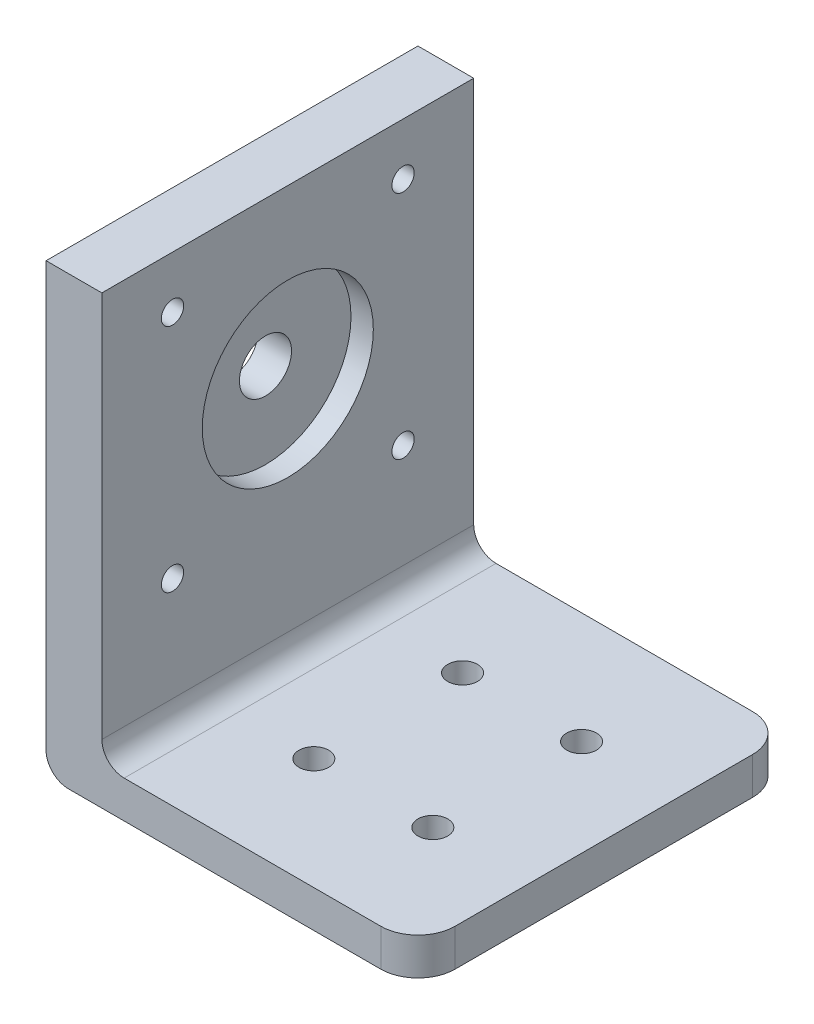
ISO-10303-21;
HEADER;
FILE_DESCRIPTION(('STEP AP214'),'2;1');
FILE_NAME('part.step','',(''),(''),'','','');
FILE_SCHEMA(('AUTOMOTIVE_DESIGN { 1 0 10303 214 1 1 1 1 }'));
ENDSEC;
DATA;
#1=APPLICATION_CONTEXT('core data for automotive mechanical design processes');
#2=APPLICATION_PROTOCOL_DEFINITION('international standard','automotive_design',2000,#1);
#3=PRODUCT_CONTEXT('',#1,'mechanical');
#4=PRODUCT('Part','Part','',(#3));
#5=PRODUCT_RELATED_PRODUCT_CATEGORY('part','',(#4));
#6=PRODUCT_DEFINITION_FORMATION('','',#4);
#7=PRODUCT_DEFINITION_CONTEXT('part definition',#1,'design');
#8=PRODUCT_DEFINITION('design','',#6,#7);
#9=PRODUCT_DEFINITION_SHAPE('','',#8);
#10=(LENGTH_UNIT() NAMED_UNIT(*) SI_UNIT(.MILLI.,.METRE.));
#11=(NAMED_UNIT(*) PLANE_ANGLE_UNIT() SI_UNIT($,.RADIAN.));
#12=(NAMED_UNIT(*) SI_UNIT($,.STERADIAN.) SOLID_ANGLE_UNIT());
#13=UNCERTAINTY_MEASURE_WITH_UNIT(LENGTH_MEASURE(1.E-05),#10,'distance_accuracy_value','');
#14=(GEOMETRIC_REPRESENTATION_CONTEXT(3) GLOBAL_UNCERTAINTY_ASSIGNED_CONTEXT((#13)) GLOBAL_UNIT_ASSIGNED_CONTEXT((#10,
#11,#12)) REPRESENTATION_CONTEXT('',''));
#15=CARTESIAN_POINT('',(0.,0.,0.));
#16=DIRECTION('',(0.,0.,1.));
#17=DIRECTION('',(1.,0.,0.));
#18=AXIS2_PLACEMENT_3D('',#15,#16,#17);
#19=CARTESIAN_POINT('',(25.,37.5,0.));
#20=DIRECTION('',(-1.,0.,0.));
#21=DIRECTION('',(0.,0.,1.));
#22=AXIS2_PLACEMENT_3D('',#19,#20,#21);
#23=CYLINDRICAL_SURFACE('',#22,3.5);
#24=CARTESIAN_POINT('',(-25.,37.5,0.));
#25=DIRECTION('',(-1.,0.,0.));
#26=DIRECTION('',(0.,0.,1.));
#27=AXIS2_PLACEMENT_3D('',#24,#25,#26);
#28=CIRCLE('',#27,3.5);
#29=CARTESIAN_POINT('',(-25.,37.5,3.5));
#30=VERTEX_POINT('',#29);
#31=EDGE_CURVE('E237',#30,#30,#28,.T.);
#32=ORIENTED_EDGE('',*,*,#31,.T.);
#33=EDGE_LOOP('',(#32));
#34=FACE_BOUND('',#33,.T.);
#35=CARTESIAN_POINT('',(-20.5,37.5,0.));
#36=DIRECTION('',(1.,0.,0.));
#37=DIRECTION('',(0.,0.,-1.));
#38=AXIS2_PLACEMENT_3D('',#35,#36,#37);
#39=CIRCLE('',#38,3.5);
#40=CARTESIAN_POINT('',(-20.5,37.5,-3.5));
#41=VERTEX_POINT('',#40);
#42=EDGE_CURVE('E46',#41,#41,#39,.F.);
#43=ORIENTED_EDGE('',*,*,#42,.F.);
#44=EDGE_LOOP('',(#43));
#45=FACE_BOUND('',#44,.T.);
#46=ADVANCED_FACE('F42',(#34,#45),#23,.F.);
#47=CARTESIAN_POINT('',(20.,5.,20.));
#48=DIRECTION('',(0.,1.,0.));
#49=DIRECTION('',(0.,0.,1.));
#50=AXIS2_PLACEMENT_3D('',#47,#48,#49);
#51=PLANE('',#50);
#52=CARTESIAN_POINT('',(-4.,5.,10.));
#53=DIRECTION('',(0.,1.,0.));
#54=DIRECTION('',(0.,0.,1.));
#55=AXIS2_PLACEMENT_3D('',#52,#53,#54);
#56=CIRCLE('',#55,2.);
#57=CARTESIAN_POINT('',(-4.,5.,12.));
#58=VERTEX_POINT('',#57);
#59=EDGE_CURVE('E258',#58,#58,#56,.T.);
#60=ORIENTED_EDGE('',*,*,#59,.F.);
#61=EDGE_LOOP('',(#60));
#62=FACE_BOUND('',#61,.T.);
#63=CARTESIAN_POINT('',(12.,5.,-10.));
#64=DIRECTION('',(0.,1.,0.));
#65=DIRECTION('',(0.,0.,-1.));
#66=AXIS2_PLACEMENT_3D('',#63,#64,#65);
#67=CIRCLE('',#66,2.);
#68=CARTESIAN_POINT('',(12.,5.,-12.));
#69=VERTEX_POINT('',#68);
#70=EDGE_CURVE('E264',#69,#69,#67,.T.);
#71=ORIENTED_EDGE('',*,*,#70,.F.);
#72=EDGE_LOOP('',(#71));
#73=FACE_BOUND('',#72,.T.);
#74=CARTESIAN_POINT('',(-4.,5.,-10.));
#75=DIRECTION('',(0.,1.,0.));
#76=DIRECTION('',(0.,0.,-1.));
#77=AXIS2_PLACEMENT_3D('',#74,#75,#76);
#78=CIRCLE('',#77,2.);
#79=CARTESIAN_POINT('',(-4.,5.,-12.));
#80=VERTEX_POINT('',#79);
#81=EDGE_CURVE('E265',#80,#80,#78,.T.);
#82=ORIENTED_EDGE('',*,*,#81,.F.);
#83=EDGE_LOOP('',(#82));
#84=FACE_BOUND('',#83,.T.);
#85=CARTESIAN_POINT('',(12.,5.,10.));
#86=DIRECTION('',(0.,1.,0.));
#87=DIRECTION('',(0.,0.,1.));
#88=AXIS2_PLACEMENT_3D('',#85,#86,#87);
#89=CIRCLE('',#88,2.);
#90=CARTESIAN_POINT('',(12.,5.,12.));
#91=VERTEX_POINT('',#90);
#92=EDGE_CURVE('E255',#91,#91,#89,.T.);
#93=ORIENTED_EDGE('',*,*,#92,.F.);
#94=EDGE_LOOP('',(#93));
#95=FACE_BOUND('',#94,.T.);
#96=DIRECTION('',(-1.,0.,0.));
#97=VECTOR('',#96,1.);
#98=CARTESIAN_POINT('',(-25.,5.,-25.));
#99=LINE('',#98,#97);
#100=CARTESIAN_POINT('',(20.,5.,-25.));
#101=VERTEX_POINT('',#100);
#102=CARTESIAN_POINT('',(-14.5,5.,-25.));
#103=VERTEX_POINT('',#102);
#104=EDGE_CURVE('E160',#101,#103,#99,.T.);
#105=ORIENTED_EDGE('',*,*,#104,.T.);
#106=DIRECTION('',(0.,0.,1.));
#107=VECTOR('',#106,1.);
#108=CARTESIAN_POINT('',(-14.5,5.,25.));
#109=LINE('',#108,#107);
#110=CARTESIAN_POINT('',(-14.5,5.,25.));
#111=VERTEX_POINT('',#110);
#112=EDGE_CURVE('E188',#103,#111,#109,.T.);
#113=ORIENTED_EDGE('',*,*,#112,.T.);
#114=DIRECTION('',(1.,0.,0.));
#115=VECTOR('',#114,1.);
#116=CARTESIAN_POINT('',(-25.,5.,25.));
#117=LINE('',#116,#115);
#118=CARTESIAN_POINT('',(20.,5.,25.));
#119=VERTEX_POINT('',#118);
#120=EDGE_CURVE('E151',#111,#119,#117,.T.);
#121=ORIENTED_EDGE('',*,*,#120,.T.);
#122=CARTESIAN_POINT('',(20.,5.,20.));
#123=DIRECTION('',(0.,1.,0.));
#124=DIRECTION('',(0.,0.,1.));
#125=AXIS2_PLACEMENT_3D('',#122,#123,#124);
#126=CIRCLE('',#125,5.);
#127=CARTESIAN_POINT('',(25.,5.,20.));
#128=VERTEX_POINT('',#127);
#129=EDGE_CURVE('E153',#119,#128,#126,.T.);
#130=ORIENTED_EDGE('',*,*,#129,.T.);
#131=DIRECTION('',(0.,0.,-1.));
#132=VECTOR('',#131,1.);
#133=CARTESIAN_POINT('',(25.,5.,-20.));
#134=LINE('',#133,#132);
#135=CARTESIAN_POINT('',(25.,5.,-20.));
#136=VERTEX_POINT('',#135);
#137=EDGE_CURVE('E156',#128,#136,#134,.T.);
#138=ORIENTED_EDGE('',*,*,#137,.T.);
#139=CARTESIAN_POINT('',(20.,5.,-20.));
#140=DIRECTION('',(0.,1.,0.));
#141=DIRECTION('',(0.,0.,-1.));
#142=AXIS2_PLACEMENT_3D('',#139,#140,#141);
#143=CIRCLE('',#142,5.);
#144=EDGE_CURVE('E158',#136,#101,#143,.T.);
#145=ORIENTED_EDGE('',*,*,#144,.T.);
#146=EDGE_LOOP('',(#105,#113,#121,#130,#138,#145));
#147=FACE_BOUND('',#146,.T.);
#148=ADVANCED_FACE('F281',(#62,#73,#84,#95,#147),#51,.T.);
#149=CARTESIAN_POINT('',(-25.,5.,-25.));
#150=DIRECTION('',(1.,0.,0.));
#151=DIRECTION('',(0.,0.,-1.));
#152=AXIS2_PLACEMENT_3D('',#149,#150,#151);
#153=PLANE('',#152);
#154=CARTESIAN_POINT('',(-25.,22.,-15.5));
#155=DIRECTION('',(-1.,0.,0.));
#156=DIRECTION('',(0.,0.,1.));
#157=AXIS2_PLACEMENT_3D('',#154,#155,#156);
#158=CIRCLE('',#157,1.5);
#159=CARTESIAN_POINT('',(-25.,22.,-14.));
#160=VERTEX_POINT('',#159);
#161=EDGE_CURVE('E240',#160,#160,#158,.T.);
#162=ORIENTED_EDGE('',*,*,#161,.F.);
#163=EDGE_LOOP('',(#162));
#164=FACE_BOUND('',#163,.T.);
#165=CARTESIAN_POINT('',(-25.,22.,15.5));
#166=DIRECTION('',(-1.,0.,0.));
#167=DIRECTION('',(0.,0.,-1.));
#168=AXIS2_PLACEMENT_3D('',#165,#166,#167);
#169=CIRCLE('',#168,1.5);
#170=CARTESIAN_POINT('',(-25.,22.,14.));
#171=VERTEX_POINT('',#170);
#172=EDGE_CURVE('E243',#171,#171,#169,.T.);
#173=ORIENTED_EDGE('',*,*,#172,.F.);
#174=EDGE_LOOP('',(#173));
#175=FACE_BOUND('',#174,.T.);
#176=ORIENTED_EDGE('',*,*,#31,.F.);
#177=EDGE_LOOP('',(#176));
#178=FACE_BOUND('',#177,.T.);
#179=CARTESIAN_POINT('',(-25.,53.,-15.5));
#180=DIRECTION('',(-1.,0.,0.));
#181=DIRECTION('',(0.,0.,-1.));
#182=AXIS2_PLACEMENT_3D('',#179,#180,#181);
#183=CIRCLE('',#182,1.5);
#184=CARTESIAN_POINT('',(-25.,53.,-17.));
#185=VERTEX_POINT('',#184);
#186=EDGE_CURVE('E235',#185,#185,#183,.T.);
#187=ORIENTED_EDGE('',*,*,#186,.F.);
#188=EDGE_LOOP('',(#187));
#189=FACE_BOUND('',#188,.T.);
#190=CARTESIAN_POINT('',(-25.,53.,15.5));
#191=DIRECTION('',(-1.,0.,0.));
#192=DIRECTION('',(0.,0.,1.));
#193=AXIS2_PLACEMENT_3D('',#190,#191,#192);
#194=CIRCLE('',#193,1.5);
#195=CARTESIAN_POINT('',(-25.,53.,17.));
#196=VERTEX_POINT('',#195);
#197=EDGE_CURVE('E205',#196,#196,#194,.T.);
#198=ORIENTED_EDGE('',*,*,#197,.F.);
#199=EDGE_LOOP('',(#198));
#200=FACE_BOUND('',#199,.T.);
#201=DIRECTION('',(0.,-1.,0.));
#202=VECTOR('',#201,1.);
#203=CARTESIAN_POINT('',(-25.,5.,-25.));
#204=LINE('',#203,#202);
#205=CARTESIAN_POINT('',(-25.,60.,-25.));
#206=VERTEX_POINT('',#205);
#207=CARTESIAN_POINT('',(-25.,3.,-25.));
#208=VERTEX_POINT('',#207);
#209=EDGE_CURVE('E163',#206,#208,#204,.T.);
#210=ORIENTED_EDGE('',*,*,#209,.T.);
#211=DIRECTION('',(0.,0.,1.));
#212=VECTOR('',#211,1.);
#213=CARTESIAN_POINT('',(-25.,3.,-25.));
#214=LINE('',#213,#212);
#215=CARTESIAN_POINT('',(-25.,3.,25.));
#216=VERTEX_POINT('',#215);
#217=EDGE_CURVE('E196',#208,#216,#214,.T.);
#218=ORIENTED_EDGE('',*,*,#217,.T.);
#219=DIRECTION('',(0.,-1.,0.));
#220=VECTOR('',#219,1.);
#221=CARTESIAN_POINT('',(-25.,5.,25.));
#222=LINE('',#221,#220);
#223=CARTESIAN_POINT('',(-25.,60.,25.));
#224=VERTEX_POINT('',#223);
#225=EDGE_CURVE('E186',#224,#216,#222,.T.);
#226=ORIENTED_EDGE('',*,*,#225,.F.);
#227=DIRECTION('',(0.,0.,1.));
#228=VECTOR('',#227,1.);
#229=CARTESIAN_POINT('',(-25.,60.,-25.));
#230=LINE('',#229,#228);
#231=EDGE_CURVE('E129',#206,#224,#230,.T.);
#232=ORIENTED_EDGE('',*,*,#231,.F.);
#233=EDGE_LOOP('',(#210,#218,#226,#232));
#234=FACE_BOUND('',#233,.T.);
#235=ADVANCED_FACE('F284',(#164,#175,#178,#189,#200,#234),#153,.F.);
#236=CARTESIAN_POINT('',(-25.,5.,25.));
#237=DIRECTION('',(0.,0.,-1.));
#238=DIRECTION('',(-1.,0.,0.));
#239=AXIS2_PLACEMENT_3D('',#236,#237,#238);
#240=PLANE('',#239);
#241=ORIENTED_EDGE('',*,*,#225,.T.);
#242=CARTESIAN_POINT('',(-22.,3.,25.));
#243=DIRECTION('',(0.,0.,-1.));
#244=DIRECTION('',(-1.,0.,0.));
#245=AXIS2_PLACEMENT_3D('',#242,#243,#244);
#246=CIRCLE('',#245,3.);
#247=CARTESIAN_POINT('',(-22.,0.,25.));
#248=VERTEX_POINT('',#247);
#249=EDGE_CURVE('E66',#216,#248,#246,.F.);
#250=ORIENTED_EDGE('',*,*,#249,.T.);
#251=DIRECTION('',(1.,0.,0.));
#252=VECTOR('',#251,1.);
#253=CARTESIAN_POINT('',(-25.,0.,25.));
#254=LINE('',#253,#252);
#255=CARTESIAN_POINT('',(20.,0.,25.));
#256=VERTEX_POINT('',#255);
#257=EDGE_CURVE('E139',#248,#256,#254,.T.);
#258=ORIENTED_EDGE('',*,*,#257,.T.);
#259=DIRECTION('',(0.,-1.,0.));
#260=VECTOR('',#259,1.);
#261=CARTESIAN_POINT('',(20.,5.,25.));
#262=LINE('',#261,#260);
#263=EDGE_CURVE('E183',#119,#256,#262,.T.);
#264=ORIENTED_EDGE('',*,*,#263,.F.);
#265=ORIENTED_EDGE('',*,*,#120,.F.);
#266=CARTESIAN_POINT('',(-14.5,8.,25.));
#267=DIRECTION('',(0.,0.,-1.));
#268=DIRECTION('',(-1.,0.,0.));
#269=AXIS2_PLACEMENT_3D('',#266,#267,#268);
#270=CIRCLE('',#269,3.);
#271=CARTESIAN_POINT('',(-17.5,8.,25.));
#272=VERTEX_POINT('',#271);
#273=EDGE_CURVE('E136',#111,#272,#270,.T.);
#274=ORIENTED_EDGE('',*,*,#273,.T.);
#275=DIRECTION('',(0.,-1.,0.));
#276=VECTOR('',#275,1.);
#277=CARTESIAN_POINT('',(-17.5,60.,25.));
#278=LINE('',#277,#276);
#279=CARTESIAN_POINT('',(-17.5,60.,25.));
#280=VERTEX_POINT('',#279);
#281=EDGE_CURVE('E133',#280,#272,#278,.T.);
#282=ORIENTED_EDGE('',*,*,#281,.F.);
#283=DIRECTION('',(1.,0.,0.));
#284=VECTOR('',#283,1.);
#285=CARTESIAN_POINT('',(-25.,60.,25.));
#286=LINE('',#285,#284);
#287=EDGE_CURVE('E121',#224,#280,#286,.T.);
#288=ORIENTED_EDGE('',*,*,#287,.F.);
#289=EDGE_LOOP('',(#241,#250,#258,#264,#265,#274,#282,#288));
#290=FACE_BOUND('',#289,.T.);
#291=ADVANCED_FACE('F134',(#290),#240,.F.);
#292=CARTESIAN_POINT('',(20.,5.,20.));
#293=DIRECTION('',(0.,-1.,0.));
#294=DIRECTION('',(0.,0.,-1.));
#295=AXIS2_PLACEMENT_3D('',#292,#293,#294);
#296=CYLINDRICAL_SURFACE('',#295,5.);
#297=CARTESIAN_POINT('',(20.,0.,20.));
#298=DIRECTION('',(0.,1.,0.));
#299=DIRECTION('',(0.,0.,1.));
#300=AXIS2_PLACEMENT_3D('',#297,#298,#299);
#301=CIRCLE('',#300,5.);
#302=CARTESIAN_POINT('',(25.,0.,20.));
#303=VERTEX_POINT('',#302);
#304=EDGE_CURVE('E165',#256,#303,#301,.T.);
#305=ORIENTED_EDGE('',*,*,#304,.T.);
#306=DIRECTION('',(0.,-1.,0.));
#307=VECTOR('',#306,1.);
#308=CARTESIAN_POINT('',(25.,5.,20.));
#309=LINE('',#308,#307);
#310=EDGE_CURVE('E180',#128,#303,#309,.T.);
#311=ORIENTED_EDGE('',*,*,#310,.F.);
#312=ORIENTED_EDGE('',*,*,#129,.F.);
#313=ORIENTED_EDGE('',*,*,#263,.T.);
#314=EDGE_LOOP('',(#305,#311,#312,#313));
#315=FACE_BOUND('',#314,.T.);
#316=ADVANCED_FACE('F336',(#315),#296,.T.);
#317=CARTESIAN_POINT('',(25.,5.,-20.));
#318=DIRECTION('',(-1.,0.,0.));
#319=DIRECTION('',(0.,0.,1.));
#320=AXIS2_PLACEMENT_3D('',#317,#318,#319);
#321=PLANE('',#320);
#322=DIRECTION('',(0.,0.,-1.));
#323=VECTOR('',#322,1.);
#324=CARTESIAN_POINT('',(25.,0.,-20.));
#325=LINE('',#324,#323);
#326=CARTESIAN_POINT('',(25.,0.,-20.));
#327=VERTEX_POINT('',#326);
#328=EDGE_CURVE('E167',#303,#327,#325,.T.);
#329=ORIENTED_EDGE('',*,*,#328,.T.);
#330=DIRECTION('',(0.,-1.,0.));
#331=VECTOR('',#330,1.);
#332=CARTESIAN_POINT('',(25.,5.,-20.));
#333=LINE('',#332,#331);
#334=EDGE_CURVE('E177',#136,#327,#333,.T.);
#335=ORIENTED_EDGE('',*,*,#334,.F.);
#336=ORIENTED_EDGE('',*,*,#137,.F.);
#337=ORIENTED_EDGE('',*,*,#310,.T.);
#338=EDGE_LOOP('',(#329,#335,#336,#337));
#339=FACE_BOUND('',#338,.T.);
#340=ADVANCED_FACE('F332',(#339),#321,.F.);
#341=CARTESIAN_POINT('',(20.,5.,-20.));
#342=DIRECTION('',(0.,-1.,0.));
#343=DIRECTION('',(0.,0.,-1.));
#344=AXIS2_PLACEMENT_3D('',#341,#342,#343);
#345=CYLINDRICAL_SURFACE('',#344,5.);
#346=CARTESIAN_POINT('',(20.,0.,-20.));
#347=DIRECTION('',(0.,1.,0.));
#348=DIRECTION('',(0.,0.,-1.));
#349=AXIS2_PLACEMENT_3D('',#346,#347,#348);
#350=CIRCLE('',#349,5.);
#351=CARTESIAN_POINT('',(20.,0.,-25.));
#352=VERTEX_POINT('',#351);
#353=EDGE_CURVE('E169',#327,#352,#350,.T.);
#354=ORIENTED_EDGE('',*,*,#353,.T.);
#355=DIRECTION('',(0.,-1.,0.));
#356=VECTOR('',#355,1.);
#357=CARTESIAN_POINT('',(20.,5.,-25.));
#358=LINE('',#357,#356);
#359=EDGE_CURVE('E174',#101,#352,#358,.T.);
#360=ORIENTED_EDGE('',*,*,#359,.F.);
#361=ORIENTED_EDGE('',*,*,#144,.F.);
#362=ORIENTED_EDGE('',*,*,#334,.T.);
#363=EDGE_LOOP('',(#354,#360,#361,#362));
#364=FACE_BOUND('',#363,.T.);
#365=ADVANCED_FACE('F329',(#364),#345,.T.);
#366=CARTESIAN_POINT('',(-25.,5.,-25.));
#367=DIRECTION('',(0.,0.,1.));
#368=DIRECTION('',(1.,0.,0.));
#369=AXIS2_PLACEMENT_3D('',#366,#367,#368);
#370=PLANE('',#369);
#371=DIRECTION('',(-1.,0.,0.));
#372=VECTOR('',#371,1.);
#373=CARTESIAN_POINT('',(-25.,0.,-25.));
#374=LINE('',#373,#372);
#375=CARTESIAN_POINT('',(-22.,0.,-25.));
#376=VERTEX_POINT('',#375);
#377=EDGE_CURVE('E154',#352,#376,#374,.T.);
#378=ORIENTED_EDGE('',*,*,#377,.T.);
#379=CARTESIAN_POINT('',(-22.,3.,-25.));
#380=DIRECTION('',(0.,0.,1.));
#381=DIRECTION('',(1.,0.,0.));
#382=AXIS2_PLACEMENT_3D('',#379,#380,#381);
#383=CIRCLE('',#382,3.);
#384=EDGE_CURVE('E11',#376,#208,#383,.F.);
#385=ORIENTED_EDGE('',*,*,#384,.T.);
#386=ORIENTED_EDGE('',*,*,#209,.F.);
#387=DIRECTION('',(1.,0.,0.));
#388=VECTOR('',#387,1.);
#389=CARTESIAN_POINT('',(-25.,60.,-25.));
#390=LINE('',#389,#388);
#391=CARTESIAN_POINT('',(-17.5,60.,-25.));
#392=VERTEX_POINT('',#391);
#393=EDGE_CURVE('E144',#206,#392,#390,.T.);
#394=ORIENTED_EDGE('',*,*,#393,.T.);
#395=DIRECTION('',(0.,-1.,0.));
#396=VECTOR('',#395,1.);
#397=CARTESIAN_POINT('',(-17.5,60.,-25.));
#398=LINE('',#397,#396);
#399=CARTESIAN_POINT('',(-17.5,8.,-25.));
#400=VERTEX_POINT('',#399);
#401=EDGE_CURVE('E140',#392,#400,#398,.T.);
#402=ORIENTED_EDGE('',*,*,#401,.T.);
#403=CARTESIAN_POINT('',(-14.5,8.,-25.));
#404=DIRECTION('',(0.,0.,1.));
#405=DIRECTION('',(1.,0.,0.));
#406=AXIS2_PLACEMENT_3D('',#403,#404,#405);
#407=CIRCLE('',#406,3.);
#408=EDGE_CURVE('E194',#400,#103,#407,.T.);
#409=ORIENTED_EDGE('',*,*,#408,.T.);
#410=ORIENTED_EDGE('',*,*,#104,.F.);
#411=ORIENTED_EDGE('',*,*,#359,.T.);
#412=EDGE_LOOP('',(#378,#385,#386,#394,#402,#409,#410,#411));
#413=FACE_BOUND('',#412,.T.);
#414=ADVANCED_FACE('F297',(#413),#370,.F.);
#415=CARTESIAN_POINT('',(20.,0.,20.));
#416=DIRECTION('',(0.,1.,0.));
#417=DIRECTION('',(0.,0.,1.));
#418=AXIS2_PLACEMENT_3D('',#415,#416,#417);
#419=PLANE('',#418);
#420=CARTESIAN_POINT('',(-4.,0.,10.));
#421=DIRECTION('',(0.,1.,0.));
#422=DIRECTION('',(0.,0.,1.));
#423=AXIS2_PLACEMENT_3D('',#420,#421,#422);
#424=CIRCLE('',#423,2.);
#425=CARTESIAN_POINT('',(-4.,0.,12.));
#426=VERTEX_POINT('',#425);
#427=EDGE_CURVE('E268',#426,#426,#424,.T.);
#428=ORIENTED_EDGE('',*,*,#427,.T.);
#429=EDGE_LOOP('',(#428));
#430=FACE_BOUND('',#429,.T.);
#431=CARTESIAN_POINT('',(12.,0.,-10.));
#432=DIRECTION('',(0.,1.,0.));
#433=DIRECTION('',(0.,0.,-1.));
#434=AXIS2_PLACEMENT_3D('',#431,#432,#433);
#435=CIRCLE('',#434,2.);
#436=CARTESIAN_POINT('',(12.,0.,-12.));
#437=VERTEX_POINT('',#436);
#438=EDGE_CURVE('E261',#437,#437,#435,.T.);
#439=ORIENTED_EDGE('',*,*,#438,.T.);
#440=EDGE_LOOP('',(#439));
#441=FACE_BOUND('',#440,.T.);
#442=CARTESIAN_POINT('',(-4.,0.,-10.));
#443=DIRECTION('',(0.,1.,0.));
#444=DIRECTION('',(0.,0.,-1.));
#445=AXIS2_PLACEMENT_3D('',#442,#443,#444);
#446=CIRCLE('',#445,2.);
#447=CARTESIAN_POINT('',(-4.,0.,-12.));
#448=VERTEX_POINT('',#447);
#449=EDGE_CURVE('E273',#448,#448,#446,.T.);
#450=ORIENTED_EDGE('',*,*,#449,.T.);
#451=EDGE_LOOP('',(#450));
#452=FACE_BOUND('',#451,.T.);
#453=CARTESIAN_POINT('',(12.,0.,10.));
#454=DIRECTION('',(0.,1.,0.));
#455=DIRECTION('',(0.,0.,1.));
#456=AXIS2_PLACEMENT_3D('',#453,#454,#455);
#457=CIRCLE('',#456,2.);
#458=CARTESIAN_POINT('',(12.,0.,12.));
#459=VERTEX_POINT('',#458);
#460=EDGE_CURVE('E252',#459,#459,#457,.T.);
#461=ORIENTED_EDGE('',*,*,#460,.T.);
#462=EDGE_LOOP('',(#461));
#463=FACE_BOUND('',#462,.T.);
#464=ORIENTED_EDGE('',*,*,#257,.F.);
#465=DIRECTION('',(0.,0.,1.));
#466=VECTOR('',#465,1.);
#467=CARTESIAN_POINT('',(-22.,0.,20.));
#468=LINE('',#467,#466);
#469=EDGE_CURVE('E51',#248,#376,#468,.F.);
#470=ORIENTED_EDGE('',*,*,#469,.T.);
#471=ORIENTED_EDGE('',*,*,#377,.F.);
#472=ORIENTED_EDGE('',*,*,#353,.F.);
#473=ORIENTED_EDGE('',*,*,#328,.F.);
#474=ORIENTED_EDGE('',*,*,#304,.F.);
#475=EDGE_LOOP('',(#464,#470,#471,#472,#473,#474));
#476=FACE_BOUND('',#475,.T.);
#477=ADVANCED_FACE('F218',(#430,#441,#452,#463,#476),#419,.F.);
#478=CARTESIAN_POINT('',(-17.5,60.,-25.));
#479=DIRECTION('',(1.,0.,0.));
#480=DIRECTION('',(0.,0.,-1.));
#481=AXIS2_PLACEMENT_3D('',#478,#479,#480);
#482=PLANE('',#481);
#483=CARTESIAN_POINT('',(-17.5,37.5,0.));
#484=DIRECTION('',(1.,0.,0.));
#485=DIRECTION('',(0.,0.,-1.));
#486=AXIS2_PLACEMENT_3D('',#483,#484,#485);
#487=CIRCLE('',#486,11.5);
#488=CARTESIAN_POINT('',(-17.5,37.5,-11.5));
#489=VERTEX_POINT('',#488);
#490=EDGE_CURVE('E248',#489,#489,#487,.T.);
#491=ORIENTED_EDGE('',*,*,#490,.F.);
#492=EDGE_LOOP('',(#491));
#493=FACE_BOUND('',#492,.T.);
#494=CARTESIAN_POINT('',(-17.5,22.,-15.5));
#495=DIRECTION('',(1.,0.,0.));
#496=DIRECTION('',(0.,0.,-1.));
#497=AXIS2_PLACEMENT_3D('',#494,#495,#496);
#498=CIRCLE('',#497,1.5);
#499=CARTESIAN_POINT('',(-17.5,22.,-17.));
#500=VERTEX_POINT('',#499);
#501=EDGE_CURVE('E130',#500,#500,#498,.T.);
#502=ORIENTED_EDGE('',*,*,#501,.F.);
#503=EDGE_LOOP('',(#502));
#504=FACE_BOUND('',#503,.T.);
#505=CARTESIAN_POINT('',(-17.5,22.,15.5));
#506=DIRECTION('',(1.,0.,0.));
#507=DIRECTION('',(0.,0.,-1.));
#508=AXIS2_PLACEMENT_3D('',#505,#506,#507);
#509=CIRCLE('',#508,1.5);
#510=CARTESIAN_POINT('',(-17.5,22.,14.));
#511=VERTEX_POINT('',#510);
#512=EDGE_CURVE('E208',#511,#511,#509,.T.);
#513=ORIENTED_EDGE('',*,*,#512,.F.);
#514=EDGE_LOOP('',(#513));
#515=FACE_BOUND('',#514,.T.);
#516=CARTESIAN_POINT('',(-17.5,53.,-15.5));
#517=DIRECTION('',(1.,0.,0.));
#518=DIRECTION('',(0.,0.,-1.));
#519=AXIS2_PLACEMENT_3D('',#516,#517,#518);
#520=CIRCLE('',#519,1.5);
#521=CARTESIAN_POINT('',(-17.5,53.,-17.));
#522=VERTEX_POINT('',#521);
#523=EDGE_CURVE('E204',#522,#522,#520,.T.);
#524=ORIENTED_EDGE('',*,*,#523,.F.);
#525=EDGE_LOOP('',(#524));
#526=FACE_BOUND('',#525,.T.);
#527=CARTESIAN_POINT('',(-17.5,53.,15.5));
#528=DIRECTION('',(1.,0.,0.));
#529=DIRECTION('',(0.,0.,-1.));
#530=AXIS2_PLACEMENT_3D('',#527,#528,#529);
#531=CIRCLE('',#530,1.5);
#532=CARTESIAN_POINT('',(-17.5,53.,14.));
#533=VERTEX_POINT('',#532);
#534=EDGE_CURVE('E201',#533,#533,#531,.T.);
#535=ORIENTED_EDGE('',*,*,#534,.F.);
#536=EDGE_LOOP('',(#535));
#537=FACE_BOUND('',#536,.T.);
#538=ORIENTED_EDGE('',*,*,#281,.T.);
#539=DIRECTION('',(0.,0.,1.));
#540=VECTOR('',#539,1.);
#541=CARTESIAN_POINT('',(-17.5,8.,-25.));
#542=LINE('',#541,#540);
#543=EDGE_CURVE('E191',#272,#400,#542,.F.);
#544=ORIENTED_EDGE('',*,*,#543,.T.);
#545=ORIENTED_EDGE('',*,*,#401,.F.);
#546=DIRECTION('',(0.,0.,1.));
#547=VECTOR('',#546,1.);
#548=CARTESIAN_POINT('',(-17.5,60.,-25.));
#549=LINE('',#548,#547);
#550=EDGE_CURVE('E126',#392,#280,#549,.T.);
#551=ORIENTED_EDGE('',*,*,#550,.T.);
#552=EDGE_LOOP('',(#538,#544,#545,#551));
#553=FACE_BOUND('',#552,.T.);
#554=ADVANCED_FACE('F142',(#493,#504,#515,#526,#537,#553),#482,.T.);
#555=CARTESIAN_POINT('',(0.,60.,0.));
#556=DIRECTION('',(0.,-1.,0.));
#557=DIRECTION('',(0.,0.,-1.));
#558=AXIS2_PLACEMENT_3D('',#555,#556,#557);
#559=PLANE('',#558);
#560=ORIENTED_EDGE('',*,*,#287,.T.);
#561=ORIENTED_EDGE('',*,*,#550,.F.);
#562=ORIENTED_EDGE('',*,*,#393,.F.);
#563=ORIENTED_EDGE('',*,*,#231,.T.);
#564=EDGE_LOOP('',(#560,#561,#562,#563));
#565=FACE_BOUND('',#564,.T.);
#566=ADVANCED_FACE('F123',(#565),#559,.F.);
#567=CARTESIAN_POINT('',(-14.5,8.,20.));
#568=DIRECTION('',(0.,0.,-1.));
#569=DIRECTION('',(-1.,0.,0.));
#570=AXIS2_PLACEMENT_3D('',#567,#568,#569);
#571=CYLINDRICAL_SURFACE('',#570,3.);
#572=ORIENTED_EDGE('',*,*,#408,.F.);
#573=ORIENTED_EDGE('',*,*,#543,.F.);
#574=ORIENTED_EDGE('',*,*,#273,.F.);
#575=ORIENTED_EDGE('',*,*,#112,.F.);
#576=EDGE_LOOP('',(#572,#573,#574,#575));
#577=FACE_BOUND('',#576,.T.);
#578=ADVANCED_FACE('F296',(#577),#571,.F.);
#579=CARTESIAN_POINT('',(-22.,3.,-25.));
#580=DIRECTION('',(0.,0.,1.));
#581=DIRECTION('',(1.,0.,0.));
#582=AXIS2_PLACEMENT_3D('',#579,#580,#581);
#583=CYLINDRICAL_SURFACE('',#582,3.);
#584=ORIENTED_EDGE('',*,*,#384,.F.);
#585=ORIENTED_EDGE('',*,*,#469,.F.);
#586=ORIENTED_EDGE('',*,*,#249,.F.);
#587=ORIENTED_EDGE('',*,*,#217,.F.);
#588=EDGE_LOOP('',(#584,#585,#586,#587));
#589=FACE_BOUND('',#588,.T.);
#590=ADVANCED_FACE('F44',(#589),#583,.T.);
#591=CARTESIAN_POINT('',(25.,53.,15.5));
#592=DIRECTION('',(-1.,0.,0.));
#593=DIRECTION('',(0.,0.,1.));
#594=AXIS2_PLACEMENT_3D('',#591,#592,#593);
#595=CYLINDRICAL_SURFACE('',#594,1.5);
#596=ORIENTED_EDGE('',*,*,#534,.T.);
#597=EDGE_LOOP('',(#596));
#598=FACE_BOUND('',#597,.T.);
#599=ORIENTED_EDGE('',*,*,#197,.T.);
#600=EDGE_LOOP('',(#599));
#601=FACE_BOUND('',#600,.T.);
#602=ADVANCED_FACE('F227',(#598,#601),#595,.F.);
#603=CARTESIAN_POINT('',(25.,53.,-15.5));
#604=DIRECTION('',(-1.,0.,0.));
#605=DIRECTION('',(0.,0.,1.));
#606=AXIS2_PLACEMENT_3D('',#603,#604,#605);
#607=CYLINDRICAL_SURFACE('',#606,1.5);
#608=ORIENTED_EDGE('',*,*,#523,.T.);
#609=EDGE_LOOP('',(#608));
#610=FACE_BOUND('',#609,.T.);
#611=ORIENTED_EDGE('',*,*,#186,.T.);
#612=EDGE_LOOP('',(#611));
#613=FACE_BOUND('',#612,.T.);
#614=ADVANCED_FACE('F230',(#610,#613),#607,.F.);
#615=CARTESIAN_POINT('',(25.,22.,15.5));
#616=DIRECTION('',(-1.,0.,0.));
#617=DIRECTION('',(0.,0.,1.));
#618=AXIS2_PLACEMENT_3D('',#615,#616,#617);
#619=CYLINDRICAL_SURFACE('',#618,1.5);
#620=ORIENTED_EDGE('',*,*,#512,.T.);
#621=EDGE_LOOP('',(#620));
#622=FACE_BOUND('',#621,.T.);
#623=ORIENTED_EDGE('',*,*,#172,.T.);
#624=EDGE_LOOP('',(#623));
#625=FACE_BOUND('',#624,.T.);
#626=ADVANCED_FACE('F315',(#622,#625),#619,.F.);
#627=CARTESIAN_POINT('',(25.,22.,-15.5));
#628=DIRECTION('',(-1.,0.,0.));
#629=DIRECTION('',(0.,0.,1.));
#630=AXIS2_PLACEMENT_3D('',#627,#628,#629);
#631=CYLINDRICAL_SURFACE('',#630,1.5);
#632=ORIENTED_EDGE('',*,*,#501,.T.);
#633=EDGE_LOOP('',(#632));
#634=FACE_BOUND('',#633,.T.);
#635=ORIENTED_EDGE('',*,*,#161,.T.);
#636=EDGE_LOOP('',(#635));
#637=FACE_BOUND('',#636,.T.);
#638=ADVANCED_FACE('F213',(#634,#637),#631,.F.);
#639=CARTESIAN_POINT('',(-20.5,37.5,0.));
#640=DIRECTION('',(1.,0.,0.));
#641=DIRECTION('',(0.,0.,-1.));
#642=AXIS2_PLACEMENT_3D('',#639,#640,#641);
#643=PLANE('',#642);
#644=CARTESIAN_POINT('',(-20.5,37.5,0.));
#645=DIRECTION('',(1.,0.,0.));
#646=DIRECTION('',(0.,0.,-1.));
#647=AXIS2_PLACEMENT_3D('',#644,#645,#646);
#648=CIRCLE('',#647,11.5);
#649=CARTESIAN_POINT('',(-20.5,37.5,-11.5));
#650=VERTEX_POINT('',#649);
#651=EDGE_CURVE('E251',#650,#650,#648,.T.);
#652=ORIENTED_EDGE('',*,*,#651,.T.);
#653=EDGE_LOOP('',(#652));
#654=FACE_BOUND('',#653,.T.);
#655=ORIENTED_EDGE('',*,*,#42,.T.);
#656=EDGE_LOOP('',(#655));
#657=FACE_BOUND('',#656,.T.);
#658=ADVANCED_FACE('F320',(#654,#657),#643,.T.);
#659=CARTESIAN_POINT('',(-20.5,37.5,0.));
#660=DIRECTION('',(1.,0.,0.));
#661=DIRECTION('',(0.,0.,-1.));
#662=AXIS2_PLACEMENT_3D('',#659,#660,#661);
#663=CYLINDRICAL_SURFACE('',#662,11.5);
#664=ORIENTED_EDGE('',*,*,#651,.F.);
#665=EDGE_LOOP('',(#664));
#666=FACE_BOUND('',#665,.T.);
#667=ORIENTED_EDGE('',*,*,#490,.T.);
#668=EDGE_LOOP('',(#667));
#669=FACE_BOUND('',#668,.T.);
#670=ADVANCED_FACE('F375',(#666,#669),#663,.F.);
#671=CARTESIAN_POINT('',(12.,0.,10.));
#672=DIRECTION('',(0.,1.,0.));
#673=DIRECTION('',(0.,0.,1.));
#674=AXIS2_PLACEMENT_3D('',#671,#672,#673);
#675=CYLINDRICAL_SURFACE('',#674,2.);
#676=ORIENTED_EDGE('',*,*,#460,.F.);
#677=EDGE_LOOP('',(#676));
#678=FACE_BOUND('',#677,.T.);
#679=ORIENTED_EDGE('',*,*,#92,.T.);
#680=EDGE_LOOP('',(#679));
#681=FACE_BOUND('',#680,.T.);
#682=ADVANCED_FACE('F384',(#678,#681),#675,.F.);
#683=CARTESIAN_POINT('',(-4.,0.,-10.));
#684=DIRECTION('',(0.,1.,0.));
#685=DIRECTION('',(0.,0.,1.));
#686=AXIS2_PLACEMENT_3D('',#683,#684,#685);
#687=CYLINDRICAL_SURFACE('',#686,2.);
#688=ORIENTED_EDGE('',*,*,#449,.F.);
#689=EDGE_LOOP('',(#688));
#690=FACE_BOUND('',#689,.T.);
#691=ORIENTED_EDGE('',*,*,#81,.T.);
#692=EDGE_LOOP('',(#691));
#693=FACE_BOUND('',#692,.T.);
#694=ADVANCED_FACE('F279',(#690,#693),#687,.F.);
#695=CARTESIAN_POINT('',(12.,0.,-10.));
#696=DIRECTION('',(0.,1.,0.));
#697=DIRECTION('',(0.,0.,1.));
#698=AXIS2_PLACEMENT_3D('',#695,#696,#697);
#699=CYLINDRICAL_SURFACE('',#698,2.);
#700=ORIENTED_EDGE('',*,*,#438,.F.);
#701=EDGE_LOOP('',(#700));
#702=FACE_BOUND('',#701,.T.);
#703=ORIENTED_EDGE('',*,*,#70,.T.);
#704=EDGE_LOOP('',(#703));
#705=FACE_BOUND('',#704,.T.);
#706=ADVANCED_FACE('F400',(#702,#705),#699,.F.);
#707=CARTESIAN_POINT('',(-4.,0.,10.));
#708=DIRECTION('',(0.,1.,0.));
#709=DIRECTION('',(0.,0.,1.));
#710=AXIS2_PLACEMENT_3D('',#707,#708,#709);
#711=CYLINDRICAL_SURFACE('',#710,2.);
#712=ORIENTED_EDGE('',*,*,#427,.F.);
#713=EDGE_LOOP('',(#712));
#714=FACE_BOUND('',#713,.T.);
#715=ORIENTED_EDGE('',*,*,#59,.T.);
#716=EDGE_LOOP('',(#715));
#717=FACE_BOUND('',#716,.T.);
#718=ADVANCED_FACE('F408',(#714,#717),#711,.F.);
#719=CLOSED_SHELL('',(#46,#148,#235,#291,#316,#340,#365,#414,#477,#554,#566,#578,#590,#602,#614,
#626,#638,#658,#670,#682,#694,#706,#718));
#720=MANIFOLD_SOLID_BREP('B2',#719);
#721=ADVANCED_BREP_SHAPE_REPRESENTATION('',(#18,#720),#14);
#722=SHAPE_DEFINITION_REPRESENTATION(#9,#721);
ENDSEC;
END-ISO-10303-21;
